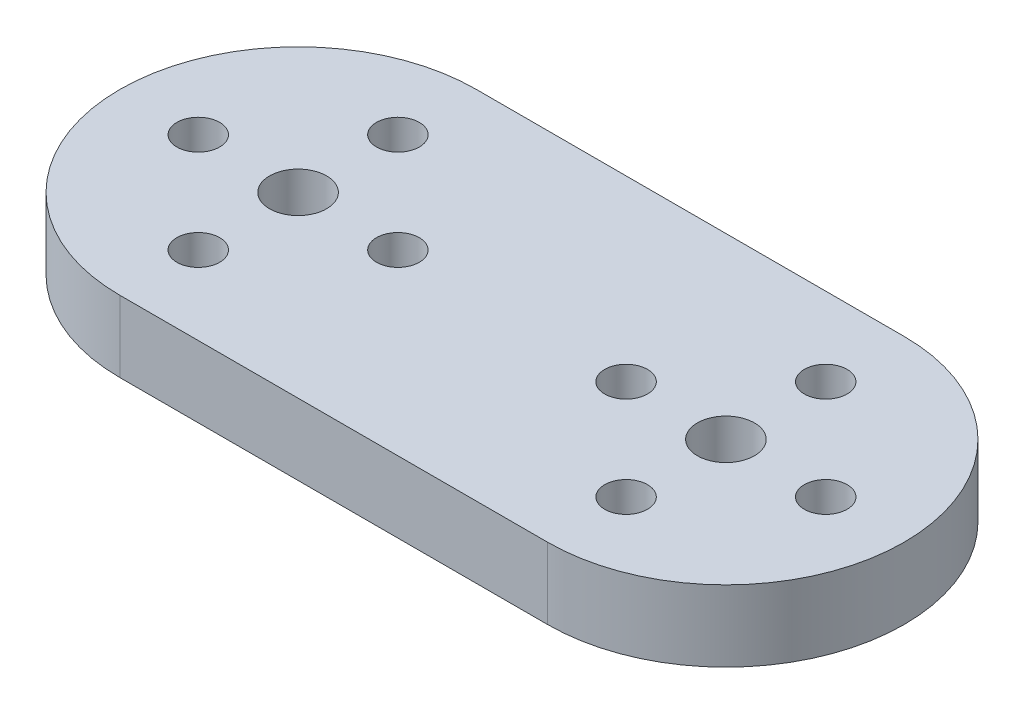
ISO-10303-21;
HEADER;
FILE_DESCRIPTION(('STEP AP214'),'2;1');
FILE_NAME('part.step','',(''),(''),'','','');
FILE_SCHEMA(('AUTOMOTIVE_DESIGN { 1 0 10303 214 1 1 1 1 }'));
ENDSEC;
DATA;
#1=APPLICATION_CONTEXT('core data for automotive mechanical design processes');
#2=APPLICATION_PROTOCOL_DEFINITION('international standard','automotive_design',2000,#1);
#3=PRODUCT_CONTEXT('',#1,'mechanical');
#4=PRODUCT('Part','Part','',(#3));
#5=PRODUCT_RELATED_PRODUCT_CATEGORY('part','',(#4));
#6=PRODUCT_DEFINITION_FORMATION('','',#4);
#7=PRODUCT_DEFINITION_CONTEXT('part definition',#1,'design');
#8=PRODUCT_DEFINITION('design','',#6,#7);
#9=PRODUCT_DEFINITION_SHAPE('','',#8);
#10=(LENGTH_UNIT() NAMED_UNIT(*) SI_UNIT(.MILLI.,.METRE.));
#11=(NAMED_UNIT(*) PLANE_ANGLE_UNIT() SI_UNIT($,.RADIAN.));
#12=(NAMED_UNIT(*) SI_UNIT($,.STERADIAN.) SOLID_ANGLE_UNIT());
#13=UNCERTAINTY_MEASURE_WITH_UNIT(LENGTH_MEASURE(1.E-05),#10,'distance_accuracy_value','');
#14=(GEOMETRIC_REPRESENTATION_CONTEXT(3) GLOBAL_UNCERTAINTY_ASSIGNED_CONTEXT((#13)) GLOBAL_UNIT_ASSIGNED_CONTEXT((#10,
#11,#12)) REPRESENTATION_CONTEXT('',''));
#15=CARTESIAN_POINT('',(0.,0.,0.));
#16=DIRECTION('',(0.,0.,1.));
#17=DIRECTION('',(1.,0.,0.));
#18=AXIS2_PLACEMENT_3D('',#15,#16,#17);
#19=CARTESIAN_POINT('',(0.,5.,0.));
#20=DIRECTION('',(0.,1.,0.));
#21=DIRECTION('',(0.,0.,1.));
#22=AXIS2_PLACEMENT_3D('',#19,#20,#21);
#23=PLANE('',#22);
#24=CARTESIAN_POINT('',(37.,5.,0.));
#25=DIRECTION('',(0.,1.,0.));
#26=DIRECTION('',(0.,0.,-1.));
#27=AXIS2_PLACEMENT_3D('',#24,#25,#26);
#28=CIRCLE('',#27,1.5);
#29=CARTESIAN_POINT('',(37.,5.,-1.5));
#30=VERTEX_POINT('',#29);
#31=EDGE_CURVE('E194',#30,#30,#28,.T.);
#32=ORIENTED_EDGE('',*,*,#31,.F.);
#33=EDGE_LOOP('',(#32));
#34=FACE_BOUND('',#33,.T.);
#35=CARTESIAN_POINT('',(23.,5.,0.));
#36=DIRECTION('',(0.,1.,0.));
#37=DIRECTION('',(0.,0.,-1.));
#38=AXIS2_PLACEMENT_3D('',#35,#36,#37);
#39=CIRCLE('',#38,1.5);
#40=CARTESIAN_POINT('',(23.,5.,-1.5));
#41=VERTEX_POINT('',#40);
#42=EDGE_CURVE('E178',#41,#41,#39,.T.);
#43=ORIENTED_EDGE('',*,*,#42,.F.);
#44=EDGE_LOOP('',(#43));
#45=FACE_BOUND('',#44,.T.);
#46=CARTESIAN_POINT('',(-7.,5.,0.));
#47=DIRECTION('',(0.,1.,0.));
#48=DIRECTION('',(0.,0.,1.));
#49=AXIS2_PLACEMENT_3D('',#46,#47,#48);
#50=CIRCLE('',#49,1.5);
#51=CARTESIAN_POINT('',(-7.,5.,1.5));
#52=VERTEX_POINT('',#51);
#53=EDGE_CURVE('E162',#52,#52,#50,.T.);
#54=ORIENTED_EDGE('',*,*,#53,.F.);
#55=EDGE_LOOP('',(#54));
#56=FACE_BOUND('',#55,.T.);
#57=CARTESIAN_POINT('',(7.,5.,0.));
#58=DIRECTION('',(0.,1.,0.));
#59=DIRECTION('',(0.,0.,1.));
#60=AXIS2_PLACEMENT_3D('',#57,#58,#59);
#61=CIRCLE('',#60,1.5);
#62=CARTESIAN_POINT('',(7.,5.,1.5));
#63=VERTEX_POINT('',#62);
#64=EDGE_CURVE('E146',#63,#63,#61,.T.);
#65=ORIENTED_EDGE('',*,*,#64,.F.);
#66=EDGE_LOOP('',(#65));
#67=FACE_BOUND('',#66,.T.);
#68=CARTESIAN_POINT('',(30.,5.,0.));
#69=DIRECTION('',(0.,1.,0.));
#70=DIRECTION('',(0.,0.,1.));
#71=AXIS2_PLACEMENT_3D('',#68,#69,#70);
#72=CIRCLE('',#71,2.);
#73=CARTESIAN_POINT('',(30.,5.,2.));
#74=VERTEX_POINT('',#73);
#75=EDGE_CURVE('E116',#74,#74,#72,.T.);
#76=ORIENTED_EDGE('',*,*,#75,.F.);
#77=EDGE_LOOP('',(#76));
#78=FACE_BOUND('',#77,.T.);
#79=CARTESIAN_POINT('',(0.,5.,0.));
#80=DIRECTION('',(0.,1.,0.));
#81=DIRECTION('',(0.,0.,1.));
#82=AXIS2_PLACEMENT_3D('',#79,#80,#81);
#83=CIRCLE('',#82,12.5);
#84=CARTESIAN_POINT('',(0.,5.,-12.5));
#85=VERTEX_POINT('',#84);
#86=CARTESIAN_POINT('',(0.,5.,12.5));
#87=VERTEX_POINT('',#86);
#88=EDGE_CURVE('E96',#85,#87,#83,.T.);
#89=ORIENTED_EDGE('',*,*,#88,.T.);
#90=DIRECTION('',(1.,0.,0.));
#91=VECTOR('',#90,1.);
#92=CARTESIAN_POINT('',(0.,5.,12.5));
#93=LINE('',#92,#91);
#94=CARTESIAN_POINT('',(30.,5.,12.5));
#95=VERTEX_POINT('',#94);
#96=EDGE_CURVE('E91',#87,#95,#93,.T.);
#97=ORIENTED_EDGE('',*,*,#96,.T.);
#98=CARTESIAN_POINT('',(30.,5.,0.));
#99=DIRECTION('',(0.,1.,0.));
#100=DIRECTION('',(0.,0.,1.));
#101=AXIS2_PLACEMENT_3D('',#98,#99,#100);
#102=CIRCLE('',#101,12.5);
#103=CARTESIAN_POINT('',(30.,5.,-12.5));
#104=VERTEX_POINT('',#103);
#105=EDGE_CURVE('E94',#95,#104,#102,.T.);
#106=ORIENTED_EDGE('',*,*,#105,.T.);
#107=DIRECTION('',(-1.,0.,0.));
#108=VECTOR('',#107,1.);
#109=CARTESIAN_POINT('',(0.,5.,-12.5));
#110=LINE('',#109,#108);
#111=EDGE_CURVE('E61',#104,#85,#110,.T.);
#112=ORIENTED_EDGE('',*,*,#111,.T.);
#113=EDGE_LOOP('',(#89,#97,#106,#112));
#114=FACE_BOUND('',#113,.T.);
#115=CARTESIAN_POINT('',(0.,5.,0.));
#116=DIRECTION('',(0.,1.,0.));
#117=DIRECTION('',(0.,0.,1.));
#118=AXIS2_PLACEMENT_3D('',#115,#116,#117);
#119=CIRCLE('',#118,2.);
#120=CARTESIAN_POINT('',(0.,5.,2.));
#121=VERTEX_POINT('',#120);
#122=EDGE_CURVE('E138',#121,#121,#119,.T.);
#123=ORIENTED_EDGE('',*,*,#122,.F.);
#124=EDGE_LOOP('',(#123));
#125=FACE_BOUND('',#124,.T.);
#126=CARTESIAN_POINT('',(0.,5.,-7.));
#127=DIRECTION('',(0.,1.,0.));
#128=DIRECTION('',(0.,0.,1.));
#129=AXIS2_PLACEMENT_3D('',#126,#127,#128);
#130=CIRCLE('',#129,1.5);
#131=CARTESIAN_POINT('',(0.,5.,-5.5));
#132=VERTEX_POINT('',#131);
#133=EDGE_CURVE('E154',#132,#132,#130,.T.);
#134=ORIENTED_EDGE('',*,*,#133,.F.);
#135=EDGE_LOOP('',(#134));
#136=FACE_BOUND('',#135,.T.);
#137=CARTESIAN_POINT('',(0.,5.,7.));
#138=DIRECTION('',(0.,1.,0.));
#139=DIRECTION('',(0.,0.,1.));
#140=AXIS2_PLACEMENT_3D('',#137,#138,#139);
#141=CIRCLE('',#140,1.5);
#142=CARTESIAN_POINT('',(0.,5.,8.5));
#143=VERTEX_POINT('',#142);
#144=EDGE_CURVE('E170',#143,#143,#141,.T.);
#145=ORIENTED_EDGE('',*,*,#144,.F.);
#146=EDGE_LOOP('',(#145));
#147=FACE_BOUND('',#146,.T.);
#148=CARTESIAN_POINT('',(30.,5.,7.));
#149=DIRECTION('',(0.,1.,0.));
#150=DIRECTION('',(0.,0.,-1.));
#151=AXIS2_PLACEMENT_3D('',#148,#149,#150);
#152=CIRCLE('',#151,1.5);
#153=CARTESIAN_POINT('',(30.,5.,5.5));
#154=VERTEX_POINT('',#153);
#155=EDGE_CURVE('E186',#154,#154,#152,.T.);
#156=ORIENTED_EDGE('',*,*,#155,.F.);
#157=EDGE_LOOP('',(#156));
#158=FACE_BOUND('',#157,.T.);
#159=CARTESIAN_POINT('',(30.,5.,-7.));
#160=DIRECTION('',(0.,1.,0.));
#161=DIRECTION('',(0.,0.,-1.));
#162=AXIS2_PLACEMENT_3D('',#159,#160,#161);
#163=CIRCLE('',#162,1.5);
#164=CARTESIAN_POINT('',(30.,5.,-8.5));
#165=VERTEX_POINT('',#164);
#166=EDGE_CURVE('E202',#165,#165,#163,.T.);
#167=ORIENTED_EDGE('',*,*,#166,.F.);
#168=EDGE_LOOP('',(#167));
#169=FACE_BOUND('',#168,.T.);
#170=ADVANCED_FACE('F43',(#34,#45,#56,#67,#78,#114,#125,#136,#147,#158,#169),#23,.T.);
#171=CARTESIAN_POINT('',(0.,0.,0.));
#172=DIRECTION('',(0.,1.,0.));
#173=DIRECTION('',(0.,0.,1.));
#174=AXIS2_PLACEMENT_3D('',#171,#172,#173);
#175=PLANE('',#174);
#176=CARTESIAN_POINT('',(0.,0.,0.));
#177=DIRECTION('',(0.,1.,0.));
#178=DIRECTION('',(0.,0.,1.));
#179=AXIS2_PLACEMENT_3D('',#176,#177,#178);
#180=CIRCLE('',#179,12.5);
#181=CARTESIAN_POINT('',(0.,0.,-12.5));
#182=VERTEX_POINT('',#181);
#183=CARTESIAN_POINT('',(0.,0.,12.5));
#184=VERTEX_POINT('',#183);
#185=EDGE_CURVE('E112',#182,#184,#180,.T.);
#186=ORIENTED_EDGE('',*,*,#185,.F.);
#187=DIRECTION('',(-1.,0.,0.));
#188=VECTOR('',#187,1.);
#189=CARTESIAN_POINT('',(0.,0.,-12.5));
#190=LINE('',#189,#188);
#191=CARTESIAN_POINT('',(30.,0.,-12.5));
#192=VERTEX_POINT('',#191);
#193=EDGE_CURVE('E84',#192,#182,#190,.T.);
#194=ORIENTED_EDGE('',*,*,#193,.F.);
#195=CARTESIAN_POINT('',(30.,0.,0.));
#196=DIRECTION('',(0.,1.,0.));
#197=DIRECTION('',(0.,0.,1.));
#198=AXIS2_PLACEMENT_3D('',#195,#196,#197);
#199=CIRCLE('',#198,12.5);
#200=CARTESIAN_POINT('',(30.,0.,12.5));
#201=VERTEX_POINT('',#200);
#202=EDGE_CURVE('E78',#201,#192,#199,.T.);
#203=ORIENTED_EDGE('',*,*,#202,.F.);
#204=DIRECTION('',(1.,0.,0.));
#205=VECTOR('',#204,1.);
#206=CARTESIAN_POINT('',(0.,0.,12.5));
#207=LINE('',#206,#205);
#208=EDGE_CURVE('E101',#184,#201,#207,.T.);
#209=ORIENTED_EDGE('',*,*,#208,.F.);
#210=EDGE_LOOP('',(#186,#194,#203,#209));
#211=FACE_BOUND('',#210,.T.);
#212=CARTESIAN_POINT('',(30.,0.,0.));
#213=DIRECTION('',(0.,1.,0.));
#214=DIRECTION('',(0.,0.,1.));
#215=AXIS2_PLACEMENT_3D('',#212,#213,#214);
#216=CIRCLE('',#215,2.);
#217=CARTESIAN_POINT('',(30.,0.,2.));
#218=VERTEX_POINT('',#217);
#219=EDGE_CURVE('E134',#218,#218,#216,.T.);
#220=ORIENTED_EDGE('',*,*,#219,.T.);
#221=EDGE_LOOP('',(#220));
#222=FACE_BOUND('',#221,.T.);
#223=CARTESIAN_POINT('',(0.,0.,0.));
#224=DIRECTION('',(0.,1.,0.));
#225=DIRECTION('',(0.,0.,1.));
#226=AXIS2_PLACEMENT_3D('',#223,#224,#225);
#227=CIRCLE('',#226,2.);
#228=CARTESIAN_POINT('',(0.,0.,2.));
#229=VERTEX_POINT('',#228);
#230=EDGE_CURVE('E142',#229,#229,#227,.T.);
#231=ORIENTED_EDGE('',*,*,#230,.T.);
#232=EDGE_LOOP('',(#231));
#233=FACE_BOUND('',#232,.T.);
#234=CARTESIAN_POINT('',(7.,0.,0.));
#235=DIRECTION('',(0.,1.,0.));
#236=DIRECTION('',(0.,0.,1.));
#237=AXIS2_PLACEMENT_3D('',#234,#235,#236);
#238=CIRCLE('',#237,1.5);
#239=CARTESIAN_POINT('',(7.,0.,1.5));
#240=VERTEX_POINT('',#239);
#241=EDGE_CURVE('E150',#240,#240,#238,.T.);
#242=ORIENTED_EDGE('',*,*,#241,.T.);
#243=EDGE_LOOP('',(#242));
#244=FACE_BOUND('',#243,.T.);
#245=CARTESIAN_POINT('',(0.,0.,-7.));
#246=DIRECTION('',(0.,1.,0.));
#247=DIRECTION('',(0.,0.,1.));
#248=AXIS2_PLACEMENT_3D('',#245,#246,#247);
#249=CIRCLE('',#248,1.5);
#250=CARTESIAN_POINT('',(0.,0.,-5.5));
#251=VERTEX_POINT('',#250);
#252=EDGE_CURVE('E158',#251,#251,#249,.T.);
#253=ORIENTED_EDGE('',*,*,#252,.T.);
#254=EDGE_LOOP('',(#253));
#255=FACE_BOUND('',#254,.T.);
#256=CARTESIAN_POINT('',(-7.,0.,0.));
#257=DIRECTION('',(0.,1.,0.));
#258=DIRECTION('',(0.,0.,1.));
#259=AXIS2_PLACEMENT_3D('',#256,#257,#258);
#260=CIRCLE('',#259,1.5);
#261=CARTESIAN_POINT('',(-7.,0.,1.5));
#262=VERTEX_POINT('',#261);
#263=EDGE_CURVE('E166',#262,#262,#260,.T.);
#264=ORIENTED_EDGE('',*,*,#263,.T.);
#265=EDGE_LOOP('',(#264));
#266=FACE_BOUND('',#265,.T.);
#267=CARTESIAN_POINT('',(0.,0.,7.));
#268=DIRECTION('',(0.,1.,0.));
#269=DIRECTION('',(0.,0.,1.));
#270=AXIS2_PLACEMENT_3D('',#267,#268,#269);
#271=CIRCLE('',#270,1.5);
#272=CARTESIAN_POINT('',(0.,0.,8.5));
#273=VERTEX_POINT('',#272);
#274=EDGE_CURVE('E174',#273,#273,#271,.T.);
#275=ORIENTED_EDGE('',*,*,#274,.T.);
#276=EDGE_LOOP('',(#275));
#277=FACE_BOUND('',#276,.T.);
#278=CARTESIAN_POINT('',(23.,0.,0.));
#279=DIRECTION('',(0.,1.,0.));
#280=DIRECTION('',(0.,0.,-1.));
#281=AXIS2_PLACEMENT_3D('',#278,#279,#280);
#282=CIRCLE('',#281,1.5);
#283=CARTESIAN_POINT('',(23.,0.,-1.5));
#284=VERTEX_POINT('',#283);
#285=EDGE_CURVE('E182',#284,#284,#282,.T.);
#286=ORIENTED_EDGE('',*,*,#285,.T.);
#287=EDGE_LOOP('',(#286));
#288=FACE_BOUND('',#287,.T.);
#289=CARTESIAN_POINT('',(30.,0.,7.));
#290=DIRECTION('',(0.,1.,0.));
#291=DIRECTION('',(0.,0.,-1.));
#292=AXIS2_PLACEMENT_3D('',#289,#290,#291);
#293=CIRCLE('',#292,1.5);
#294=CARTESIAN_POINT('',(30.,0.,5.5));
#295=VERTEX_POINT('',#294);
#296=EDGE_CURVE('E190',#295,#295,#293,.T.);
#297=ORIENTED_EDGE('',*,*,#296,.T.);
#298=EDGE_LOOP('',(#297));
#299=FACE_BOUND('',#298,.T.);
#300=CARTESIAN_POINT('',(37.,0.,0.));
#301=DIRECTION('',(0.,1.,0.));
#302=DIRECTION('',(0.,0.,-1.));
#303=AXIS2_PLACEMENT_3D('',#300,#301,#302);
#304=CIRCLE('',#303,1.5);
#305=CARTESIAN_POINT('',(37.,0.,-1.5));
#306=VERTEX_POINT('',#305);
#307=EDGE_CURVE('E198',#306,#306,#304,.T.);
#308=ORIENTED_EDGE('',*,*,#307,.T.);
#309=EDGE_LOOP('',(#308));
#310=FACE_BOUND('',#309,.T.);
#311=CARTESIAN_POINT('',(30.,0.,-7.));
#312=DIRECTION('',(0.,1.,0.));
#313=DIRECTION('',(0.,0.,-1.));
#314=AXIS2_PLACEMENT_3D('',#311,#312,#313);
#315=CIRCLE('',#314,1.5);
#316=CARTESIAN_POINT('',(30.,0.,-8.5));
#317=VERTEX_POINT('',#316);
#318=EDGE_CURVE('E206',#317,#317,#315,.T.);
#319=ORIENTED_EDGE('',*,*,#318,.T.);
#320=EDGE_LOOP('',(#319));
#321=FACE_BOUND('',#320,.T.);
#322=ADVANCED_FACE('F129',(#211,#222,#233,#244,#255,#266,#277,#288,#299,#310,#321),#175,.F.);
#323=CARTESIAN_POINT('',(0.,5.,0.));
#324=DIRECTION('',(0.,-1.,0.));
#325=DIRECTION('',(0.,0.,-1.));
#326=AXIS2_PLACEMENT_3D('',#323,#324,#325);
#327=CYLINDRICAL_SURFACE('',#326,12.5);
#328=ORIENTED_EDGE('',*,*,#185,.T.);
#329=DIRECTION('',(0.,-1.,0.));
#330=VECTOR('',#329,1.);
#331=CARTESIAN_POINT('',(0.,5.,12.5));
#332=LINE('',#331,#330);
#333=EDGE_CURVE('E11',#87,#184,#332,.T.);
#334=ORIENTED_EDGE('',*,*,#333,.F.);
#335=ORIENTED_EDGE('',*,*,#88,.F.);
#336=DIRECTION('',(0.,-1.,0.));
#337=VECTOR('',#336,1.);
#338=CARTESIAN_POINT('',(0.,5.,-12.5));
#339=LINE('',#338,#337);
#340=EDGE_CURVE('E108',#85,#182,#339,.T.);
#341=ORIENTED_EDGE('',*,*,#340,.T.);
#342=EDGE_LOOP('',(#328,#334,#335,#341));
#343=FACE_BOUND('',#342,.T.);
#344=ADVANCED_FACE('F45',(#343),#327,.T.);
#345=CARTESIAN_POINT('',(0.,5.,12.5));
#346=DIRECTION('',(0.,0.,-1.));
#347=DIRECTION('',(-1.,0.,0.));
#348=AXIS2_PLACEMENT_3D('',#345,#346,#347);
#349=PLANE('',#348);
#350=ORIENTED_EDGE('',*,*,#208,.T.);
#351=DIRECTION('',(0.,-1.,0.));
#352=VECTOR('',#351,1.);
#353=CARTESIAN_POINT('',(30.,5.,12.5));
#354=LINE('',#353,#352);
#355=EDGE_CURVE('E53',#95,#201,#354,.T.);
#356=ORIENTED_EDGE('',*,*,#355,.F.);
#357=ORIENTED_EDGE('',*,*,#96,.F.);
#358=ORIENTED_EDGE('',*,*,#333,.T.);
#359=EDGE_LOOP('',(#350,#356,#357,#358));
#360=FACE_BOUND('',#359,.T.);
#361=ADVANCED_FACE('F100',(#360),#349,.F.);
#362=CARTESIAN_POINT('',(30.,5.,0.));
#363=DIRECTION('',(0.,-1.,0.));
#364=DIRECTION('',(0.,0.,-1.));
#365=AXIS2_PLACEMENT_3D('',#362,#363,#364);
#366=CYLINDRICAL_SURFACE('',#365,12.5);
#367=ORIENTED_EDGE('',*,*,#202,.T.);
#368=DIRECTION('',(0.,-1.,0.));
#369=VECTOR('',#368,1.);
#370=CARTESIAN_POINT('',(30.,5.,-12.5));
#371=LINE('',#370,#369);
#372=EDGE_CURVE('E103',#104,#192,#371,.T.);
#373=ORIENTED_EDGE('',*,*,#372,.F.);
#374=ORIENTED_EDGE('',*,*,#105,.F.);
#375=ORIENTED_EDGE('',*,*,#355,.T.);
#376=EDGE_LOOP('',(#367,#373,#374,#375));
#377=FACE_BOUND('',#376,.T.);
#378=ADVANCED_FACE('F104',(#377),#366,.T.);
#379=CARTESIAN_POINT('',(0.,5.,-12.5));
#380=DIRECTION('',(0.,0.,1.));
#381=DIRECTION('',(1.,0.,0.));
#382=AXIS2_PLACEMENT_3D('',#379,#380,#381);
#383=PLANE('',#382);
#384=ORIENTED_EDGE('',*,*,#193,.T.);
#385=ORIENTED_EDGE('',*,*,#340,.F.);
#386=ORIENTED_EDGE('',*,*,#111,.F.);
#387=ORIENTED_EDGE('',*,*,#372,.T.);
#388=EDGE_LOOP('',(#384,#385,#386,#387));
#389=FACE_BOUND('',#388,.T.);
#390=ADVANCED_FACE('F126',(#389),#383,.F.);
#391=CARTESIAN_POINT('',(30.,5.,0.));
#392=DIRECTION('',(0.,-1.,0.));
#393=DIRECTION('',(0.,0.,-1.));
#394=AXIS2_PLACEMENT_3D('',#391,#392,#393);
#395=CYLINDRICAL_SURFACE('',#394,2.);
#396=ORIENTED_EDGE('',*,*,#75,.T.);
#397=EDGE_LOOP('',(#396));
#398=FACE_BOUND('',#397,.T.);
#399=ORIENTED_EDGE('',*,*,#219,.F.);
#400=EDGE_LOOP('',(#399));
#401=FACE_BOUND('',#400,.T.);
#402=ADVANCED_FACE('F227',(#398,#401),#395,.F.);
#403=CARTESIAN_POINT('',(0.,5.,0.));
#404=DIRECTION('',(0.,-1.,0.));
#405=DIRECTION('',(0.,0.,-1.));
#406=AXIS2_PLACEMENT_3D('',#403,#404,#405);
#407=CYLINDRICAL_SURFACE('',#406,2.);
#408=ORIENTED_EDGE('',*,*,#122,.T.);
#409=EDGE_LOOP('',(#408));
#410=FACE_BOUND('',#409,.T.);
#411=ORIENTED_EDGE('',*,*,#230,.F.);
#412=EDGE_LOOP('',(#411));
#413=FACE_BOUND('',#412,.T.);
#414=ADVANCED_FACE('F281',(#410,#413),#407,.F.);
#415=CARTESIAN_POINT('',(7.,5.,0.));
#416=DIRECTION('',(0.,-1.,0.));
#417=DIRECTION('',(0.,0.,-1.));
#418=AXIS2_PLACEMENT_3D('',#415,#416,#417);
#419=CYLINDRICAL_SURFACE('',#418,1.5);
#420=ORIENTED_EDGE('',*,*,#64,.T.);
#421=EDGE_LOOP('',(#420));
#422=FACE_BOUND('',#421,.T.);
#423=ORIENTED_EDGE('',*,*,#241,.F.);
#424=EDGE_LOOP('',(#423));
#425=FACE_BOUND('',#424,.T.);
#426=ADVANCED_FACE('F290',(#422,#425),#419,.F.);
#427=CARTESIAN_POINT('',(0.,5.,-7.));
#428=DIRECTION('',(0.,-1.,0.));
#429=DIRECTION('',(0.,0.,-1.));
#430=AXIS2_PLACEMENT_3D('',#427,#428,#429);
#431=CYLINDRICAL_SURFACE('',#430,1.5);
#432=ORIENTED_EDGE('',*,*,#133,.T.);
#433=EDGE_LOOP('',(#432));
#434=FACE_BOUND('',#433,.T.);
#435=ORIENTED_EDGE('',*,*,#252,.F.);
#436=EDGE_LOOP('',(#435));
#437=FACE_BOUND('',#436,.T.);
#438=ADVANCED_FACE('F299',(#434,#437),#431,.F.);
#439=CARTESIAN_POINT('',(-7.,5.,0.));
#440=DIRECTION('',(0.,-1.,0.));
#441=DIRECTION('',(0.,0.,-1.));
#442=AXIS2_PLACEMENT_3D('',#439,#440,#441);
#443=CYLINDRICAL_SURFACE('',#442,1.5);
#444=ORIENTED_EDGE('',*,*,#53,.T.);
#445=EDGE_LOOP('',(#444));
#446=FACE_BOUND('',#445,.T.);
#447=ORIENTED_EDGE('',*,*,#263,.F.);
#448=EDGE_LOOP('',(#447));
#449=FACE_BOUND('',#448,.T.);
#450=ADVANCED_FACE('F309',(#446,#449),#443,.F.);
#451=CARTESIAN_POINT('',(0.,5.,7.));
#452=DIRECTION('',(0.,-1.,0.));
#453=DIRECTION('',(0.,0.,-1.));
#454=AXIS2_PLACEMENT_3D('',#451,#452,#453);
#455=CYLINDRICAL_SURFACE('',#454,1.5);
#456=ORIENTED_EDGE('',*,*,#144,.T.);
#457=EDGE_LOOP('',(#456));
#458=FACE_BOUND('',#457,.T.);
#459=ORIENTED_EDGE('',*,*,#274,.F.);
#460=EDGE_LOOP('',(#459));
#461=FACE_BOUND('',#460,.T.);
#462=ADVANCED_FACE('F319',(#458,#461),#455,.F.);
#463=CARTESIAN_POINT('',(23.,5.,0.));
#464=DIRECTION('',(0.,-1.,0.));
#465=DIRECTION('',(0.,0.,-1.));
#466=AXIS2_PLACEMENT_3D('',#463,#464,#465);
#467=CYLINDRICAL_SURFACE('',#466,1.5);
#468=ORIENTED_EDGE('',*,*,#42,.T.);
#469=EDGE_LOOP('',(#468));
#470=FACE_BOUND('',#469,.T.);
#471=ORIENTED_EDGE('',*,*,#285,.F.);
#472=EDGE_LOOP('',(#471));
#473=FACE_BOUND('',#472,.T.);
#474=ADVANCED_FACE('F329',(#470,#473),#467,.F.);
#475=CARTESIAN_POINT('',(30.,5.,7.));
#476=DIRECTION('',(0.,-1.,0.));
#477=DIRECTION('',(0.,0.,-1.));
#478=AXIS2_PLACEMENT_3D('',#475,#476,#477);
#479=CYLINDRICAL_SURFACE('',#478,1.5);
#480=ORIENTED_EDGE('',*,*,#155,.T.);
#481=EDGE_LOOP('',(#480));
#482=FACE_BOUND('',#481,.T.);
#483=ORIENTED_EDGE('',*,*,#296,.F.);
#484=EDGE_LOOP('',(#483));
#485=FACE_BOUND('',#484,.T.);
#486=ADVANCED_FACE('F339',(#482,#485),#479,.F.);
#487=CARTESIAN_POINT('',(37.,5.,0.));
#488=DIRECTION('',(0.,-1.,0.));
#489=DIRECTION('',(0.,0.,-1.));
#490=AXIS2_PLACEMENT_3D('',#487,#488,#489);
#491=CYLINDRICAL_SURFACE('',#490,1.5);
#492=ORIENTED_EDGE('',*,*,#31,.T.);
#493=EDGE_LOOP('',(#492));
#494=FACE_BOUND('',#493,.T.);
#495=ORIENTED_EDGE('',*,*,#307,.F.);
#496=EDGE_LOOP('',(#495));
#497=FACE_BOUND('',#496,.T.);
#498=ADVANCED_FACE('F349',(#494,#497),#491,.F.);
#499=CARTESIAN_POINT('',(30.,5.,-7.));
#500=DIRECTION('',(0.,-1.,0.));
#501=DIRECTION('',(0.,0.,-1.));
#502=AXIS2_PLACEMENT_3D('',#499,#500,#501);
#503=CYLINDRICAL_SURFACE('',#502,1.5);
#504=ORIENTED_EDGE('',*,*,#166,.T.);
#505=EDGE_LOOP('',(#504));
#506=FACE_BOUND('',#505,.T.);
#507=ORIENTED_EDGE('',*,*,#318,.F.);
#508=EDGE_LOOP('',(#507));
#509=FACE_BOUND('',#508,.T.);
#510=ADVANCED_FACE('F214',(#506,#509),#503,.F.);
#511=CLOSED_SHELL('',(#170,#322,#344,#361,#378,#390,#402,#414,#426,#438,#450,#462,#474,#486,
#498,#510));
#512=MANIFOLD_SOLID_BREP('B2',#511);
#513=ADVANCED_BREP_SHAPE_REPRESENTATION('',(#18,#512),#14);
#514=SHAPE_DEFINITION_REPRESENTATION(#9,#513);
ENDSEC;
END-ISO-10303-21;
